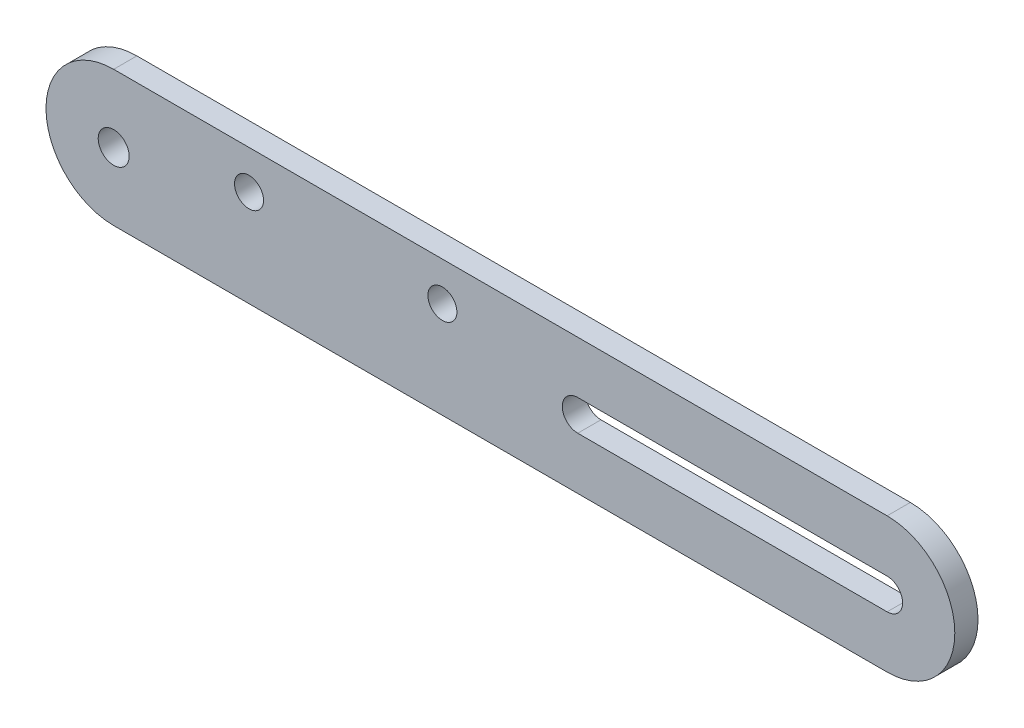
ISO-10303-21;
HEADER;
FILE_DESCRIPTION(('STEP AP214'),'2;1');
FILE_NAME('part.step','',(''),(''),'','','');
FILE_SCHEMA(('AUTOMOTIVE_DESIGN { 1 0 10303 214 1 1 1 1 }'));
ENDSEC;
DATA;
#1=APPLICATION_CONTEXT('core data for automotive mechanical design processes');
#2=APPLICATION_PROTOCOL_DEFINITION('international standard','automotive_design',2000,#1);
#3=PRODUCT_CONTEXT('',#1,'mechanical');
#4=PRODUCT('Part','Part','',(#3));
#5=PRODUCT_RELATED_PRODUCT_CATEGORY('part','',(#4));
#6=PRODUCT_DEFINITION_FORMATION('','',#4);
#7=PRODUCT_DEFINITION_CONTEXT('part definition',#1,'design');
#8=PRODUCT_DEFINITION('design','',#6,#7);
#9=PRODUCT_DEFINITION_SHAPE('','',#8);
#10=(LENGTH_UNIT() NAMED_UNIT(*) SI_UNIT(.MILLI.,.METRE.));
#11=(NAMED_UNIT(*) PLANE_ANGLE_UNIT() SI_UNIT($,.RADIAN.));
#12=(NAMED_UNIT(*) SI_UNIT($,.STERADIAN.) SOLID_ANGLE_UNIT());
#13=UNCERTAINTY_MEASURE_WITH_UNIT(LENGTH_MEASURE(1.E-05),#10,'distance_accuracy_value','');
#14=(GEOMETRIC_REPRESENTATION_CONTEXT(3) GLOBAL_UNCERTAINTY_ASSIGNED_CONTEXT((#13)) GLOBAL_UNIT_ASSIGNED_CONTEXT((#10,
#11,#12)) REPRESENTATION_CONTEXT('',''));
#15=CARTESIAN_POINT('',(0.,0.,0.));
#16=DIRECTION('',(0.,0.,1.));
#17=DIRECTION('',(1.,0.,0.));
#18=AXIS2_PLACEMENT_3D('',#15,#16,#17);
#19=CARTESIAN_POINT('',(-111.286517574633,0.,6.));
#20=DIRECTION('',(0.,0.,1.));
#21=DIRECTION('',(1.,0.,0.));
#22=AXIS2_PLACEMENT_3D('',#19,#20,#21);
#23=PLANE('',#22);
#24=CARTESIAN_POINT('',(-76.2865175746326,7.5,6.));
#25=DIRECTION('',(0.,0.,1.));
#26=DIRECTION('',(1.,0.,0.));
#27=AXIS2_PLACEMENT_3D('',#24,#25,#26);
#28=CIRCLE('',#27,3.75000000000001);
#29=CARTESIAN_POINT('',(-72.5365175746326,7.5,6.));
#30=VERTEX_POINT('',#29);
#31=EDGE_CURVE('E274',#30,#30,#28,.T.);
#32=ORIENTED_EDGE('',*,*,#31,.F.);
#33=EDGE_LOOP('',(#32));
#34=FACE_BOUND('',#33,.T.);
#35=CARTESIAN_POINT('',(-26.2865175746326,7.5,6.));
#36=DIRECTION('',(0.,0.,1.));
#37=DIRECTION('',(1.,0.,0.));
#38=AXIS2_PLACEMENT_3D('',#35,#36,#37);
#39=CIRCLE('',#38,3.75);
#40=CARTESIAN_POINT('',(-22.5365175746326,7.5,6.));
#41=VERTEX_POINT('',#40);
#42=EDGE_CURVE('E283',#41,#41,#39,.T.);
#43=ORIENTED_EDGE('',*,*,#42,.F.);
#44=EDGE_LOOP('',(#43));
#45=FACE_BOUND('',#44,.T.);
#46=CARTESIAN_POINT('',(-111.286517574633,0.,6.));
#47=DIRECTION('',(0.,0.,1.));
#48=DIRECTION('',(1.,0.,0.));
#49=AXIS2_PLACEMENT_3D('',#46,#47,#48);
#50=CIRCLE('',#49,17.5);
#51=CARTESIAN_POINT('',(-111.286517574633,17.5,6.));
#52=VERTEX_POINT('',#51);
#53=CARTESIAN_POINT('',(-111.286517574633,-17.5,6.));
#54=VERTEX_POINT('',#53);
#55=EDGE_CURVE('E163',#52,#54,#50,.T.);
#56=ORIENTED_EDGE('',*,*,#55,.T.);
#57=DIRECTION('',(1.,0.,0.));
#58=VECTOR('',#57,1.);
#59=CARTESIAN_POINT('',(-111.286517574633,-17.5,6.));
#60=LINE('',#59,#58);
#61=CARTESIAN_POINT('',(88.7134824253674,-17.5,6.));
#62=VERTEX_POINT('',#61);
#63=EDGE_CURVE('E167',#54,#62,#60,.T.);
#64=ORIENTED_EDGE('',*,*,#63,.T.);
#65=CARTESIAN_POINT('',(88.7134824253674,0.,6.));
#66=DIRECTION('',(0.,0.,1.));
#67=DIRECTION('',(1.,0.,0.));
#68=AXIS2_PLACEMENT_3D('',#65,#66,#67);
#69=CIRCLE('',#68,17.5);
#70=CARTESIAN_POINT('',(88.7134824253674,17.5,6.));
#71=VERTEX_POINT('',#70);
#72=EDGE_CURVE('E171',#62,#71,#69,.T.);
#73=ORIENTED_EDGE('',*,*,#72,.T.);
#74=DIRECTION('',(-1.,0.,0.));
#75=VECTOR('',#74,1.);
#76=CARTESIAN_POINT('',(-111.286517574633,17.5,6.));
#77=LINE('',#76,#75);
#78=EDGE_CURVE('E174',#71,#52,#77,.T.);
#79=ORIENTED_EDGE('',*,*,#78,.T.);
#80=EDGE_LOOP('',(#56,#64,#73,#79));
#81=FACE_BOUND('',#80,.T.);
#82=CARTESIAN_POINT('',(-111.286517574633,0.,6.));
#83=DIRECTION('',(0.,0.,1.));
#84=DIRECTION('',(1.,0.,0.));
#85=AXIS2_PLACEMENT_3D('',#82,#83,#84);
#86=CIRCLE('',#85,4.00000000000001);
#87=CARTESIAN_POINT('',(-107.286517574633,0.,6.));
#88=VERTEX_POINT('',#87);
#89=EDGE_CURVE('E155',#88,#88,#86,.T.);
#90=ORIENTED_EDGE('',*,*,#89,.F.);
#91=EDGE_LOOP('',(#90));
#92=FACE_BOUND('',#91,.T.);
#93=DIRECTION('',(-1.,0.,0.));
#94=VECTOR('',#93,1.);
#95=CARTESIAN_POINT('',(88.7134824253674,4.,6.));
#96=LINE('',#95,#94);
#97=CARTESIAN_POINT('',(88.7134824253674,4.,6.));
#98=VERTEX_POINT('',#97);
#99=CARTESIAN_POINT('',(8.71348242536741,4.,6.));
#100=VERTEX_POINT('',#99);
#101=EDGE_CURVE('E114',#98,#100,#96,.T.);
#102=ORIENTED_EDGE('',*,*,#101,.F.);
#103=CARTESIAN_POINT('',(88.7134824253674,0.,6.));
#104=DIRECTION('',(0.,0.,1.));
#105=DIRECTION('',(1.,0.,0.));
#106=AXIS2_PLACEMENT_3D('',#103,#104,#105);
#107=CIRCLE('',#106,4.);
#108=CARTESIAN_POINT('',(88.7134824253674,-4.,6.));
#109=VERTEX_POINT('',#108);
#110=EDGE_CURVE('E105',#109,#98,#107,.T.);
#111=ORIENTED_EDGE('',*,*,#110,.F.);
#112=DIRECTION('',(1.,0.,0.));
#113=VECTOR('',#112,1.);
#114=CARTESIAN_POINT('',(88.7134824253674,-4.,6.));
#115=LINE('',#114,#113);
#116=CARTESIAN_POINT('',(8.71348242536742,-4.00000000000001,6.));
#117=VERTEX_POINT('',#116);
#118=EDGE_CURVE('E131',#117,#109,#115,.T.);
#119=ORIENTED_EDGE('',*,*,#118,.F.);
#120=CARTESIAN_POINT('',(8.71348242536741,0.,6.));
#121=DIRECTION('',(0.,0.,1.));
#122=DIRECTION('',(1.,0.,0.));
#123=AXIS2_PLACEMENT_3D('',#120,#121,#122);
#124=CIRCLE('',#123,4.);
#125=EDGE_CURVE('E127',#100,#117,#124,.T.);
#126=ORIENTED_EDGE('',*,*,#125,.F.);
#127=EDGE_LOOP('',(#102,#111,#119,#126));
#128=FACE_BOUND('',#127,.T.);
#129=ADVANCED_FACE('F39',(#34,#45,#81,#92,#128),#23,.T.);
#130=CARTESIAN_POINT('',(-111.286517574633,0.,0.));
#131=DIRECTION('',(0.,0.,1.));
#132=DIRECTION('',(1.,0.,0.));
#133=AXIS2_PLACEMENT_3D('',#130,#131,#132);
#134=PLANE('',#133);
#135=CARTESIAN_POINT('',(-76.2865175746326,7.5,0.));
#136=DIRECTION('',(0.,0.,1.));
#137=DIRECTION('',(1.,0.,0.));
#138=AXIS2_PLACEMENT_3D('',#135,#136,#137);
#139=CIRCLE('',#138,3.75000000000001);
#140=CARTESIAN_POINT('',(-72.5365175746326,7.5,0.));
#141=VERTEX_POINT('',#140);
#142=EDGE_CURVE('E139',#141,#141,#139,.F.);
#143=ORIENTED_EDGE('',*,*,#142,.F.);
#144=EDGE_LOOP('',(#143));
#145=FACE_BOUND('',#144,.T.);
#146=CARTESIAN_POINT('',(-26.2865175746326,7.5,0.));
#147=DIRECTION('',(0.,0.,1.));
#148=DIRECTION('',(1.,0.,0.));
#149=AXIS2_PLACEMENT_3D('',#146,#147,#148);
#150=CIRCLE('',#149,3.75);
#151=CARTESIAN_POINT('',(-22.5365175746326,7.5,0.));
#152=VERTEX_POINT('',#151);
#153=EDGE_CURVE('E280',#152,#152,#150,.F.);
#154=ORIENTED_EDGE('',*,*,#153,.F.);
#155=EDGE_LOOP('',(#154));
#156=FACE_BOUND('',#155,.T.);
#157=CARTESIAN_POINT('',(-111.286517574633,0.,0.));
#158=DIRECTION('',(0.,0.,1.));
#159=DIRECTION('',(1.,0.,0.));
#160=AXIS2_PLACEMENT_3D('',#157,#158,#159);
#161=CIRCLE('',#160,4.00000000000001);
#162=CARTESIAN_POINT('',(-107.286517574633,0.,0.));
#163=VERTEX_POINT('',#162);
#164=EDGE_CURVE('E123',#163,#163,#161,.T.);
#165=ORIENTED_EDGE('',*,*,#164,.T.);
#166=EDGE_LOOP('',(#165));
#167=FACE_BOUND('',#166,.T.);
#168=CARTESIAN_POINT('',(-111.286517574633,0.,0.));
#169=DIRECTION('',(0.,0.,1.));
#170=DIRECTION('',(1.,0.,0.));
#171=AXIS2_PLACEMENT_3D('',#168,#169,#170);
#172=CIRCLE('',#171,17.5);
#173=CARTESIAN_POINT('',(-111.286517574633,17.5,0.));
#174=VERTEX_POINT('',#173);
#175=CARTESIAN_POINT('',(-111.286517574633,-17.5,0.));
#176=VERTEX_POINT('',#175);
#177=EDGE_CURVE('E159',#174,#176,#172,.T.);
#178=ORIENTED_EDGE('',*,*,#177,.F.);
#179=DIRECTION('',(-1.,0.,0.));
#180=VECTOR('',#179,1.);
#181=CARTESIAN_POINT('',(-111.286517574633,17.5,0.));
#182=LINE('',#181,#180);
#183=CARTESIAN_POINT('',(88.7134824253674,17.5,0.));
#184=VERTEX_POINT('',#183);
#185=EDGE_CURVE('E168',#184,#174,#182,.T.);
#186=ORIENTED_EDGE('',*,*,#185,.F.);
#187=CARTESIAN_POINT('',(88.7134824253674,0.,0.));
#188=DIRECTION('',(0.,0.,1.));
#189=DIRECTION('',(1.,0.,0.));
#190=AXIS2_PLACEMENT_3D('',#187,#188,#189);
#191=CIRCLE('',#190,17.5);
#192=CARTESIAN_POINT('',(88.7134824253674,-17.5,0.));
#193=VERTEX_POINT('',#192);
#194=EDGE_CURVE('E184',#193,#184,#191,.T.);
#195=ORIENTED_EDGE('',*,*,#194,.F.);
#196=DIRECTION('',(1.,0.,0.));
#197=VECTOR('',#196,1.);
#198=CARTESIAN_POINT('',(-111.286517574633,-17.5,0.));
#199=LINE('',#198,#197);
#200=EDGE_CURVE('E181',#176,#193,#199,.T.);
#201=ORIENTED_EDGE('',*,*,#200,.F.);
#202=EDGE_LOOP('',(#178,#186,#195,#201));
#203=FACE_BOUND('',#202,.T.);
#204=CARTESIAN_POINT('',(88.7134824253674,0.,0.));
#205=DIRECTION('',(0.,0.,1.));
#206=DIRECTION('',(1.,0.,0.));
#207=AXIS2_PLACEMENT_3D('',#204,#205,#206);
#208=CIRCLE('',#207,4.);
#209=CARTESIAN_POINT('',(88.7134824253674,-4.,0.));
#210=VERTEX_POINT('',#209);
#211=CARTESIAN_POINT('',(88.7134824253674,4.,0.));
#212=VERTEX_POINT('',#211);
#213=EDGE_CURVE('E63',#210,#212,#208,.T.);
#214=ORIENTED_EDGE('',*,*,#213,.T.);
#215=DIRECTION('',(-1.,0.,0.));
#216=VECTOR('',#215,1.);
#217=CARTESIAN_POINT('',(88.7134824253674,4.,0.));
#218=LINE('',#217,#216);
#219=CARTESIAN_POINT('',(8.71348242536741,4.,0.));
#220=VERTEX_POINT('',#219);
#221=EDGE_CURVE('E121',#212,#220,#218,.T.);
#222=ORIENTED_EDGE('',*,*,#221,.T.);
#223=CARTESIAN_POINT('',(8.71348242536741,0.,0.));
#224=DIRECTION('',(0.,0.,1.));
#225=DIRECTION('',(1.,0.,0.));
#226=AXIS2_PLACEMENT_3D('',#223,#224,#225);
#227=CIRCLE('',#226,4.);
#228=CARTESIAN_POINT('',(8.71348242536741,-4.00000000000001,0.));
#229=VERTEX_POINT('',#228);
#230=EDGE_CURVE('E142',#220,#229,#227,.T.);
#231=ORIENTED_EDGE('',*,*,#230,.T.);
#232=DIRECTION('',(1.,0.,0.));
#233=VECTOR('',#232,1.);
#234=CARTESIAN_POINT('',(88.7134824253674,-4.,0.));
#235=LINE('',#234,#233);
#236=EDGE_CURVE('E115',#229,#210,#235,.T.);
#237=ORIENTED_EDGE('',*,*,#236,.T.);
#238=EDGE_LOOP('',(#214,#222,#231,#237));
#239=FACE_BOUND('',#238,.T.);
#240=ADVANCED_FACE('F207',(#145,#156,#167,#203,#239),#134,.F.);
#241=CARTESIAN_POINT('',(-111.286517574633,0.,6.));
#242=DIRECTION('',(0.,0.,-1.));
#243=DIRECTION('',(-1.,0.,0.));
#244=AXIS2_PLACEMENT_3D('',#241,#242,#243);
#245=CYLINDRICAL_SURFACE('',#244,17.5);
#246=ORIENTED_EDGE('',*,*,#177,.T.);
#247=DIRECTION('',(0.,0.,-1.));
#248=VECTOR('',#247,1.);
#249=CARTESIAN_POINT('',(-111.286517574633,-17.5,6.));
#250=LINE('',#249,#248);
#251=EDGE_CURVE('E11',#54,#176,#250,.T.);
#252=ORIENTED_EDGE('',*,*,#251,.F.);
#253=ORIENTED_EDGE('',*,*,#55,.F.);
#254=DIRECTION('',(0.,0.,-1.));
#255=VECTOR('',#254,1.);
#256=CARTESIAN_POINT('',(-111.286517574633,17.5,6.));
#257=LINE('',#256,#255);
#258=EDGE_CURVE('E177',#52,#174,#257,.T.);
#259=ORIENTED_EDGE('',*,*,#258,.T.);
#260=EDGE_LOOP('',(#246,#252,#253,#259));
#261=FACE_BOUND('',#260,.T.);
#262=ADVANCED_FACE('F41',(#261),#245,.T.);
#263=CARTESIAN_POINT('',(-111.286517574633,-17.5,6.));
#264=DIRECTION('',(0.,1.,0.));
#265=DIRECTION('',(0.,0.,1.));
#266=AXIS2_PLACEMENT_3D('',#263,#264,#265);
#267=PLANE('',#266);
#268=ORIENTED_EDGE('',*,*,#200,.T.);
#269=DIRECTION('',(0.,0.,-1.));
#270=VECTOR('',#269,1.);
#271=CARTESIAN_POINT('',(88.7134824253674,-17.5,6.));
#272=LINE('',#271,#270);
#273=EDGE_CURVE('E48',#62,#193,#272,.T.);
#274=ORIENTED_EDGE('',*,*,#273,.F.);
#275=ORIENTED_EDGE('',*,*,#63,.F.);
#276=ORIENTED_EDGE('',*,*,#251,.T.);
#277=EDGE_LOOP('',(#268,#274,#275,#276));
#278=FACE_BOUND('',#277,.T.);
#279=ADVANCED_FACE('F218',(#278),#267,.F.);
#280=CARTESIAN_POINT('',(88.7134824253674,0.,6.));
#281=DIRECTION('',(0.,0.,-1.));
#282=DIRECTION('',(-1.,0.,0.));
#283=AXIS2_PLACEMENT_3D('',#280,#281,#282);
#284=CYLINDRICAL_SURFACE('',#283,17.5);
#285=ORIENTED_EDGE('',*,*,#194,.T.);
#286=DIRECTION('',(0.,0.,-1.));
#287=VECTOR('',#286,1.);
#288=CARTESIAN_POINT('',(88.7134824253674,17.5,6.));
#289=LINE('',#288,#287);
#290=EDGE_CURVE('E192',#71,#184,#289,.T.);
#291=ORIENTED_EDGE('',*,*,#290,.F.);
#292=ORIENTED_EDGE('',*,*,#72,.F.);
#293=ORIENTED_EDGE('',*,*,#273,.T.);
#294=EDGE_LOOP('',(#285,#291,#292,#293));
#295=FACE_BOUND('',#294,.T.);
#296=ADVANCED_FACE('F201',(#295),#284,.T.);
#297=CARTESIAN_POINT('',(-111.286517574633,17.5,6.));
#298=DIRECTION('',(0.,-1.,0.));
#299=DIRECTION('',(0.,0.,-1.));
#300=AXIS2_PLACEMENT_3D('',#297,#298,#299);
#301=PLANE('',#300);
#302=ORIENTED_EDGE('',*,*,#185,.T.);
#303=ORIENTED_EDGE('',*,*,#258,.F.);
#304=ORIENTED_EDGE('',*,*,#78,.F.);
#305=ORIENTED_EDGE('',*,*,#290,.T.);
#306=EDGE_LOOP('',(#302,#303,#304,#305));
#307=FACE_BOUND('',#306,.T.);
#308=ADVANCED_FACE('F211',(#307),#301,.F.);
#309=CARTESIAN_POINT('',(-111.286517574633,0.,6.));
#310=DIRECTION('',(0.,0.,-1.));
#311=DIRECTION('',(-1.,0.,0.));
#312=AXIS2_PLACEMENT_3D('',#309,#310,#311);
#313=CYLINDRICAL_SURFACE('',#312,4.00000000000001);
#314=ORIENTED_EDGE('',*,*,#89,.T.);
#315=EDGE_LOOP('',(#314));
#316=FACE_BOUND('',#315,.T.);
#317=ORIENTED_EDGE('',*,*,#164,.F.);
#318=EDGE_LOOP('',(#317));
#319=FACE_BOUND('',#318,.T.);
#320=ADVANCED_FACE('F236',(#316,#319),#313,.F.);
#321=CARTESIAN_POINT('',(88.7134824253674,0.,6.));
#322=DIRECTION('',(0.,0.,-1.));
#323=DIRECTION('',(-1.,0.,0.));
#324=AXIS2_PLACEMENT_3D('',#321,#322,#323);
#325=CYLINDRICAL_SURFACE('',#324,4.);
#326=ORIENTED_EDGE('',*,*,#213,.F.);
#327=DIRECTION('',(0.,0.,-1.));
#328=VECTOR('',#327,1.);
#329=CARTESIAN_POINT('',(88.7134824253674,-4.,6.));
#330=LINE('',#329,#328);
#331=EDGE_CURVE('E109',#109,#210,#330,.T.);
#332=ORIENTED_EDGE('',*,*,#331,.F.);
#333=ORIENTED_EDGE('',*,*,#110,.T.);
#334=DIRECTION('',(0.,0.,-1.));
#335=VECTOR('',#334,1.);
#336=CARTESIAN_POINT('',(88.7134824253674,4.,6.));
#337=LINE('',#336,#335);
#338=EDGE_CURVE('E108',#98,#212,#337,.T.);
#339=ORIENTED_EDGE('',*,*,#338,.T.);
#340=EDGE_LOOP('',(#326,#332,#333,#339));
#341=FACE_BOUND('',#340,.T.);
#342=ADVANCED_FACE('F107',(#341),#325,.F.);
#343=CARTESIAN_POINT('',(88.7134824253674,4.,6.));
#344=DIRECTION('',(0.,-1.,0.));
#345=DIRECTION('',(1.,0.,0.));
#346=AXIS2_PLACEMENT_3D('',#343,#344,#345);
#347=PLANE('',#346);
#348=ORIENTED_EDGE('',*,*,#221,.F.);
#349=ORIENTED_EDGE('',*,*,#338,.F.);
#350=ORIENTED_EDGE('',*,*,#101,.T.);
#351=DIRECTION('',(0.,0.,-1.));
#352=VECTOR('',#351,1.);
#353=CARTESIAN_POINT('',(8.71348242536741,4.,6.));
#354=LINE('',#353,#352);
#355=EDGE_CURVE('E124',#100,#220,#354,.T.);
#356=ORIENTED_EDGE('',*,*,#355,.T.);
#357=EDGE_LOOP('',(#348,#349,#350,#356));
#358=FACE_BOUND('',#357,.T.);
#359=ADVANCED_FACE('F118',(#358),#347,.T.);
#360=CARTESIAN_POINT('',(8.71348242536741,0.,6.));
#361=DIRECTION('',(0.,0.,-1.));
#362=DIRECTION('',(-1.,0.,0.));
#363=AXIS2_PLACEMENT_3D('',#360,#361,#362);
#364=CYLINDRICAL_SURFACE('',#363,4.);
#365=ORIENTED_EDGE('',*,*,#230,.F.);
#366=ORIENTED_EDGE('',*,*,#355,.F.);
#367=ORIENTED_EDGE('',*,*,#125,.T.);
#368=DIRECTION('',(0.,0.,-1.));
#369=VECTOR('',#368,1.);
#370=CARTESIAN_POINT('',(8.71348242536741,-4.00000000000001,6.));
#371=LINE('',#370,#369);
#372=EDGE_CURVE('E55',#117,#229,#371,.T.);
#373=ORIENTED_EDGE('',*,*,#372,.T.);
#374=EDGE_LOOP('',(#365,#366,#367,#373));
#375=FACE_BOUND('',#374,.T.);
#376=ADVANCED_FACE('F254',(#375),#364,.F.);
#377=CARTESIAN_POINT('',(88.7134824253674,-4.,6.));
#378=DIRECTION('',(0.,1.,0.));
#379=DIRECTION('',(-1.,0.,0.));
#380=AXIS2_PLACEMENT_3D('',#377,#378,#379);
#381=PLANE('',#380);
#382=ORIENTED_EDGE('',*,*,#236,.F.);
#383=ORIENTED_EDGE('',*,*,#372,.F.);
#384=ORIENTED_EDGE('',*,*,#118,.T.);
#385=ORIENTED_EDGE('',*,*,#331,.T.);
#386=EDGE_LOOP('',(#382,#383,#384,#385));
#387=FACE_BOUND('',#386,.T.);
#388=ADVANCED_FACE('F259',(#387),#381,.T.);
#389=CARTESIAN_POINT('',(-26.2865175746326,7.5,-0.00100000000000013));
#390=DIRECTION('',(0.,0.,1.));
#391=DIRECTION('',(1.,0.,0.));
#392=AXIS2_PLACEMENT_3D('',#389,#390,#391);
#393=CYLINDRICAL_SURFACE('',#392,3.75);
#394=CARTESIAN_POINT('',(-22.5365175746326,7.5,6.));
#395=CARTESIAN_POINT('',(-22.5365175746326,7.5,5.9375));
#396=CARTESIAN_POINT('',(-22.5365175746326,7.5,5.875));
#397=CARTESIAN_POINT('',(-22.5365175746326,7.5,5.75));
#398=CARTESIAN_POINT('',(-22.5365175746326,7.5,5.6875));
#399=CARTESIAN_POINT('',(-22.5365175746326,7.5,5.5625));
#400=CARTESIAN_POINT('',(-22.5365175746326,7.5,5.5));
#401=CARTESIAN_POINT('',(-22.5365175746326,7.5,5.375));
#402=CARTESIAN_POINT('',(-22.5365175746326,7.5,5.3125));
#403=CARTESIAN_POINT('',(-22.5365175746326,7.5,5.1875));
#404=CARTESIAN_POINT('',(-22.5365175746326,7.5,5.125));
#405=CARTESIAN_POINT('',(-22.5365175746326,7.5,5.));
#406=CARTESIAN_POINT('',(-22.5365175746326,7.5,4.9375));
#407=CARTESIAN_POINT('',(-22.5365175746326,7.5,4.8125));
#408=CARTESIAN_POINT('',(-22.5365175746326,7.5,4.75));
#409=CARTESIAN_POINT('',(-22.5365175746326,7.5,4.625));
#410=CARTESIAN_POINT('',(-22.5365175746326,7.5,4.5625));
#411=CARTESIAN_POINT('',(-22.5365175746326,7.5,4.4375));
#412=CARTESIAN_POINT('',(-22.5365175746326,7.5,4.375));
#413=CARTESIAN_POINT('',(-22.5365175746326,7.5,4.25));
#414=CARTESIAN_POINT('',(-22.5365175746326,7.5,4.1875));
#415=CARTESIAN_POINT('',(-22.5365175746326,7.5,4.0625));
#416=CARTESIAN_POINT('',(-22.5365175746326,7.5,4.));
#417=CARTESIAN_POINT('',(-22.5365175746326,7.5,3.875));
#418=CARTESIAN_POINT('',(-22.5365175746326,7.5,3.8125));
#419=CARTESIAN_POINT('',(-22.5365175746326,7.5,3.6875));
#420=CARTESIAN_POINT('',(-22.5365175746326,7.5,3.625));
#421=CARTESIAN_POINT('',(-22.5365175746326,7.5,3.5));
#422=CARTESIAN_POINT('',(-22.5365175746326,7.5,3.4375));
#423=CARTESIAN_POINT('',(-22.5365175746326,7.5,3.3125));
#424=CARTESIAN_POINT('',(-22.5365175746326,7.5,3.25));
#425=CARTESIAN_POINT('',(-22.5365175746326,7.5,3.125));
#426=CARTESIAN_POINT('',(-22.5365175746326,7.5,3.0625));
#427=CARTESIAN_POINT('',(-22.5365175746326,7.5,2.9375));
#428=CARTESIAN_POINT('',(-22.5365175746326,7.5,2.875));
#429=CARTESIAN_POINT('',(-22.5365175746326,7.5,2.75));
#430=CARTESIAN_POINT('',(-22.5365175746326,7.5,2.6875));
#431=CARTESIAN_POINT('',(-22.5365175746326,7.5,2.5625));
#432=CARTESIAN_POINT('',(-22.5365175746326,7.5,2.5));
#433=CARTESIAN_POINT('',(-22.5365175746326,7.5,2.375));
#434=CARTESIAN_POINT('',(-22.5365175746326,7.5,2.3125));
#435=CARTESIAN_POINT('',(-22.5365175746326,7.5,2.1875));
#436=CARTESIAN_POINT('',(-22.5365175746326,7.5,2.125));
#437=CARTESIAN_POINT('',(-22.5365175746326,7.5,2.));
#438=CARTESIAN_POINT('',(-22.5365175746326,7.5,1.9375));
#439=CARTESIAN_POINT('',(-22.5365175746326,7.5,1.8125));
#440=CARTESIAN_POINT('',(-22.5365175746326,7.5,1.75));
#441=CARTESIAN_POINT('',(-22.5365175746326,7.5,1.625));
#442=CARTESIAN_POINT('',(-22.5365175746326,7.5,1.5625));
#443=CARTESIAN_POINT('',(-22.5365175746326,7.5,1.4375));
#444=CARTESIAN_POINT('',(-22.5365175746326,7.5,1.375));
#445=CARTESIAN_POINT('',(-22.5365175746326,7.5,1.25));
#446=CARTESIAN_POINT('',(-22.5365175746326,7.5,1.1875));
#447=CARTESIAN_POINT('',(-22.5365175746326,7.5,1.0625));
#448=CARTESIAN_POINT('',(-22.5365175746326,7.5,1.));
#449=CARTESIAN_POINT('',(-22.5365175746326,7.5,0.875));
#450=CARTESIAN_POINT('',(-22.5365175746326,7.5,0.8125));
#451=CARTESIAN_POINT('',(-22.5365175746326,7.5,0.6875));
#452=CARTESIAN_POINT('',(-22.5365175746326,7.5,0.625));
#453=CARTESIAN_POINT('',(-22.5365175746326,7.5,0.5));
#454=CARTESIAN_POINT('',(-22.5365175746326,7.5,0.4375));
#455=CARTESIAN_POINT('',(-22.5365175746326,7.5,0.3125));
#456=CARTESIAN_POINT('',(-22.5365175746326,7.5,0.25));
#457=CARTESIAN_POINT('',(-22.5365175746326,7.5,0.125));
#458=CARTESIAN_POINT('',(-22.5365175746326,7.5,0.0625000000000001));
#459=CARTESIAN_POINT('',(-22.5365175746326,7.5,0.));
#460=B_SPLINE_CURVE_WITH_KNOTS('',3,(#394,#395,#396,#397,#398,#399,#400,#401,#402,#403,#404,
#405,#406,#407,#408,#409,#410,#411,#412,#413,#414,#415,#416,#417,#418,#419,#420,#421,#422,#423,
#424,#425,#426,#427,#428,#429,#430,#431,#432,#433,#434,#435,#436,#437,#438,#439,#440,#441,#442,
#443,#444,#445,#446,#447,#448,#449,#450,#451,#452,#453,#454,#455,#456,#457,#458,#459),
.UNSPECIFIED.,.F.,.F.,(4,2,2,2,2,2,2,2,2,2,2,2,2,2,2,2,2,2,2,2,2,2,2,2,2,2,2,2,2,2,2,2,4),(0.,
0.1875,0.375,0.5625,0.75,0.9375,1.125,1.3125,1.5,1.6875,1.875,2.0625,2.25,2.4375,2.625,2.8125,
3.,3.1875,3.375,3.5625,3.75,3.9375,4.125,4.3125,4.5,4.6875,4.875,5.0625,5.25,5.4375,5.625,
5.8125,6.),.UNSPECIFIED.);
#461=EDGE_CURVE('BSEAM263',#41,#152,#460,.T.);
#462=ORIENTED_EDGE('',*,*,#42,.T.);
#463=ORIENTED_EDGE('',*,*,#153,.T.);
#464=ORIENTED_EDGE('',*,*,#461,.T.);
#465=ORIENTED_EDGE('',*,*,#461,.F.);
#466=EDGE_LOOP('',(#462,#464,#463,#465));
#467=FACE_BOUND('',#466,.T.);
#468=ADVANCED_FACE('F263',(#467),#393,.F.);
#469=CARTESIAN_POINT('',(-76.2865175746326,7.5,-0.00100000000000013));
#470=DIRECTION('',(0.,0.,1.));
#471=DIRECTION('',(1.,0.,0.));
#472=AXIS2_PLACEMENT_3D('',#469,#470,#471);
#473=CYLINDRICAL_SURFACE('',#472,3.75000000000001);
#474=CARTESIAN_POINT('',(-72.5365175746326,7.5,6.));
#475=CARTESIAN_POINT('',(-72.5365175746326,7.5,5.9375));
#476=CARTESIAN_POINT('',(-72.5365175746326,7.5,5.875));
#477=CARTESIAN_POINT('',(-72.5365175746326,7.5,5.75));
#478=CARTESIAN_POINT('',(-72.5365175746326,7.5,5.6875));
#479=CARTESIAN_POINT('',(-72.5365175746326,7.5,5.5625));
#480=CARTESIAN_POINT('',(-72.5365175746326,7.5,5.5));
#481=CARTESIAN_POINT('',(-72.5365175746326,7.5,5.375));
#482=CARTESIAN_POINT('',(-72.5365175746326,7.5,5.3125));
#483=CARTESIAN_POINT('',(-72.5365175746326,7.5,5.1875));
#484=CARTESIAN_POINT('',(-72.5365175746326,7.5,5.125));
#485=CARTESIAN_POINT('',(-72.5365175746326,7.5,5.));
#486=CARTESIAN_POINT('',(-72.5365175746326,7.5,4.9375));
#487=CARTESIAN_POINT('',(-72.5365175746326,7.5,4.8125));
#488=CARTESIAN_POINT('',(-72.5365175746326,7.5,4.75));
#489=CARTESIAN_POINT('',(-72.5365175746326,7.5,4.625));
#490=CARTESIAN_POINT('',(-72.5365175746326,7.5,4.5625));
#491=CARTESIAN_POINT('',(-72.5365175746326,7.5,4.4375));
#492=CARTESIAN_POINT('',(-72.5365175746326,7.5,4.375));
#493=CARTESIAN_POINT('',(-72.5365175746326,7.5,4.25));
#494=CARTESIAN_POINT('',(-72.5365175746326,7.5,4.1875));
#495=CARTESIAN_POINT('',(-72.5365175746326,7.5,4.0625));
#496=CARTESIAN_POINT('',(-72.5365175746326,7.5,4.));
#497=CARTESIAN_POINT('',(-72.5365175746326,7.5,3.875));
#498=CARTESIAN_POINT('',(-72.5365175746326,7.5,3.8125));
#499=CARTESIAN_POINT('',(-72.5365175746326,7.5,3.6875));
#500=CARTESIAN_POINT('',(-72.5365175746326,7.5,3.625));
#501=CARTESIAN_POINT('',(-72.5365175746326,7.5,3.5));
#502=CARTESIAN_POINT('',(-72.5365175746326,7.5,3.4375));
#503=CARTESIAN_POINT('',(-72.5365175746326,7.5,3.3125));
#504=CARTESIAN_POINT('',(-72.5365175746326,7.5,3.25));
#505=CARTESIAN_POINT('',(-72.5365175746326,7.5,3.125));
#506=CARTESIAN_POINT('',(-72.5365175746326,7.5,3.0625));
#507=CARTESIAN_POINT('',(-72.5365175746326,7.5,2.9375));
#508=CARTESIAN_POINT('',(-72.5365175746326,7.5,2.875));
#509=CARTESIAN_POINT('',(-72.5365175746326,7.5,2.75));
#510=CARTESIAN_POINT('',(-72.5365175746326,7.5,2.6875));
#511=CARTESIAN_POINT('',(-72.5365175746326,7.5,2.5625));
#512=CARTESIAN_POINT('',(-72.5365175746326,7.5,2.5));
#513=CARTESIAN_POINT('',(-72.5365175746326,7.5,2.375));
#514=CARTESIAN_POINT('',(-72.5365175746326,7.5,2.3125));
#515=CARTESIAN_POINT('',(-72.5365175746326,7.5,2.1875));
#516=CARTESIAN_POINT('',(-72.5365175746326,7.5,2.125));
#517=CARTESIAN_POINT('',(-72.5365175746326,7.5,2.));
#518=CARTESIAN_POINT('',(-72.5365175746326,7.5,1.9375));
#519=CARTESIAN_POINT('',(-72.5365175746326,7.5,1.8125));
#520=CARTESIAN_POINT('',(-72.5365175746326,7.5,1.75));
#521=CARTESIAN_POINT('',(-72.5365175746326,7.5,1.625));
#522=CARTESIAN_POINT('',(-72.5365175746326,7.5,1.5625));
#523=CARTESIAN_POINT('',(-72.5365175746326,7.5,1.4375));
#524=CARTESIAN_POINT('',(-72.5365175746326,7.5,1.375));
#525=CARTESIAN_POINT('',(-72.5365175746326,7.5,1.25));
#526=CARTESIAN_POINT('',(-72.5365175746326,7.5,1.1875));
#527=CARTESIAN_POINT('',(-72.5365175746326,7.5,1.0625));
#528=CARTESIAN_POINT('',(-72.5365175746326,7.5,1.));
#529=CARTESIAN_POINT('',(-72.5365175746326,7.5,0.875));
#530=CARTESIAN_POINT('',(-72.5365175746326,7.5,0.8125));
#531=CARTESIAN_POINT('',(-72.5365175746326,7.5,0.6875));
#532=CARTESIAN_POINT('',(-72.5365175746326,7.5,0.625));
#533=CARTESIAN_POINT('',(-72.5365175746326,7.5,0.5));
#534=CARTESIAN_POINT('',(-72.5365175746326,7.5,0.4375));
#535=CARTESIAN_POINT('',(-72.5365175746326,7.5,0.3125));
#536=CARTESIAN_POINT('',(-72.5365175746326,7.5,0.25));
#537=CARTESIAN_POINT('',(-72.5365175746326,7.5,0.125));
#538=CARTESIAN_POINT('',(-72.5365175746326,7.5,0.0625000000000001));
#539=CARTESIAN_POINT('',(-72.5365175746326,7.5,0.));
#540=B_SPLINE_CURVE_WITH_KNOTS('',3,(#474,#475,#476,#477,#478,#479,#480,#481,#482,#483,#484,
#485,#486,#487,#488,#489,#490,#491,#492,#493,#494,#495,#496,#497,#498,#499,#500,#501,#502,#503,
#504,#505,#506,#507,#508,#509,#510,#511,#512,#513,#514,#515,#516,#517,#518,#519,#520,#521,#522,
#523,#524,#525,#526,#527,#528,#529,#530,#531,#532,#533,#534,#535,#536,#537,#538,#539),
.UNSPECIFIED.,.F.,.F.,(4,2,2,2,2,2,2,2,2,2,2,2,2,2,2,2,2,2,2,2,2,2,2,2,2,2,2,2,2,2,2,2,4),(0.,
0.1875,0.375,0.5625,0.75,0.9375,1.125,1.3125,1.5,1.6875,1.875,2.0625,2.25,2.4375,2.625,2.8125,
3.,3.1875,3.375,3.5625,3.75,3.9375,4.125,4.3125,4.5,4.6875,4.875,5.0625,5.25,5.4375,5.625,
5.8125,6.),.UNSPECIFIED.);
#541=EDGE_CURVE('BSEAM266',#30,#141,#540,.T.);
#542=ORIENTED_EDGE('',*,*,#31,.T.);
#543=ORIENTED_EDGE('',*,*,#142,.T.);
#544=ORIENTED_EDGE('',*,*,#541,.T.);
#545=ORIENTED_EDGE('',*,*,#541,.F.);
#546=EDGE_LOOP('',(#542,#544,#543,#545));
#547=FACE_BOUND('',#546,.T.);
#548=ADVANCED_FACE('F266',(#547),#473,.F.);
#549=CLOSED_SHELL('',(#129,#240,#262,#279,#296,#308,#320,#342,#359,#376,#388,#468,#548));
#550=MANIFOLD_SOLID_BREP('B2',#549);
#551=ADVANCED_BREP_SHAPE_REPRESENTATION('',(#18,#550),#14);
#552=SHAPE_DEFINITION_REPRESENTATION(#9,#551);
ENDSEC;
END-ISO-10303-21;
